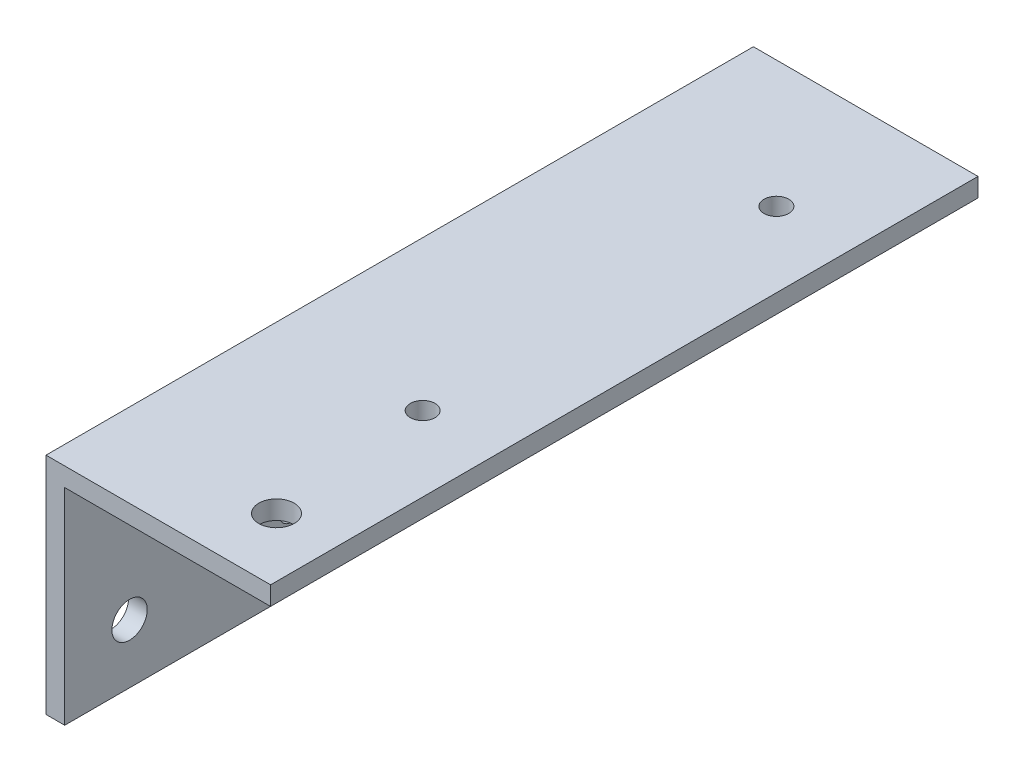
ISO-10303-21;
HEADER;
FILE_DESCRIPTION(('STEP AP214'),'2;1');
FILE_NAME('part.step','',(''),(''),'','','');
FILE_SCHEMA(('AUTOMOTIVE_DESIGN { 1 0 10303 214 1 1 1 1 }'));
ENDSEC;
DATA;
#1=APPLICATION_CONTEXT('core data for automotive mechanical design processes');
#2=APPLICATION_PROTOCOL_DEFINITION('international standard','automotive_design',2000,#1);
#3=PRODUCT_CONTEXT('',#1,'mechanical');
#4=PRODUCT('Part','Part','',(#3));
#5=PRODUCT_RELATED_PRODUCT_CATEGORY('part','',(#4));
#6=PRODUCT_DEFINITION_FORMATION('','',#4);
#7=PRODUCT_DEFINITION_CONTEXT('part definition',#1,'design');
#8=PRODUCT_DEFINITION('design','',#6,#7);
#9=PRODUCT_DEFINITION_SHAPE('','',#8);
#10=(LENGTH_UNIT() NAMED_UNIT(*) SI_UNIT(.MILLI.,.METRE.));
#11=(NAMED_UNIT(*) PLANE_ANGLE_UNIT() SI_UNIT($,.RADIAN.));
#12=(NAMED_UNIT(*) SI_UNIT($,.STERADIAN.) SOLID_ANGLE_UNIT());
#13=UNCERTAINTY_MEASURE_WITH_UNIT(LENGTH_MEASURE(1.E-05),#10,'distance_accuracy_value','');
#14=(GEOMETRIC_REPRESENTATION_CONTEXT(3) GLOBAL_UNCERTAINTY_ASSIGNED_CONTEXT((#13)) GLOBAL_UNIT_ASSIGNED_CONTEXT((#10,
#11,#12)) REPRESENTATION_CONTEXT('',''));
#15=CARTESIAN_POINT('',(0.,0.,0.));
#16=DIRECTION('',(0.,0.,1.));
#17=DIRECTION('',(1.,0.,0.));
#18=AXIS2_PLACEMENT_3D('',#15,#16,#17);
#19=CARTESIAN_POINT('',(34.925,3.17499999999999,5.));
#20=DIRECTION('',(0.,0.,1.));
#21=DIRECTION('',(1.,0.,0.));
#22=AXIS2_PLACEMENT_3D('',#19,#20,#21);
#23=PLANE('',#22);
#24=DIRECTION('',(0.,1.,0.));
#25=VECTOR('',#24,1.);
#26=CARTESIAN_POINT('',(0.,-34.925,5.));
#27=LINE('',#26,#25);
#28=CARTESIAN_POINT('',(0.,-34.925,5.));
#29=VERTEX_POINT('',#28);
#30=CARTESIAN_POINT('',(0.,0.,5.));
#31=VERTEX_POINT('',#30);
#32=EDGE_CURVE('E64',#29,#31,#27,.T.);
#33=ORIENTED_EDGE('',*,*,#32,.T.);
#34=DIRECTION('',(1.,0.,0.));
#35=VECTOR('',#34,1.);
#36=CARTESIAN_POINT('',(0.,0.,5.));
#37=LINE('',#36,#35);
#38=CARTESIAN_POINT('',(34.925,0.,5.));
#39=VERTEX_POINT('',#38);
#40=EDGE_CURVE('E119',#31,#39,#37,.T.);
#41=ORIENTED_EDGE('',*,*,#40,.T.);
#42=DIRECTION('',(0.,-1.,0.));
#43=VECTOR('',#42,1.);
#44=CARTESIAN_POINT('',(34.925,3.17499999999999,5.));
#45=LINE('',#44,#43);
#46=CARTESIAN_POINT('',(34.925,3.17499999999999,5.));
#47=VERTEX_POINT('',#46);
#48=EDGE_CURVE('E54',#47,#39,#45,.T.);
#49=ORIENTED_EDGE('',*,*,#48,.F.);
#50=DIRECTION('',(-1.,0.,0.));
#51=VECTOR('',#50,1.);
#52=CARTESIAN_POINT('',(34.925,3.17499999999999,5.));
#53=LINE('',#52,#51);
#54=CARTESIAN_POINT('',(-3.175,3.17499999999999,5.));
#55=VERTEX_POINT('',#54);
#56=EDGE_CURVE('E153',#47,#55,#53,.T.);
#57=ORIENTED_EDGE('',*,*,#56,.T.);
#58=DIRECTION('',(0.,-1.,0.));
#59=VECTOR('',#58,1.);
#60=CARTESIAN_POINT('',(-3.175,3.17499999999999,5.));
#61=LINE('',#60,#59);
#62=CARTESIAN_POINT('',(-3.175,-34.925,5.));
#63=VERTEX_POINT('',#62);
#64=EDGE_CURVE('E11',#55,#63,#61,.T.);
#65=ORIENTED_EDGE('',*,*,#64,.T.);
#66=DIRECTION('',(-1.,0.,0.));
#67=VECTOR('',#66,1.);
#68=CARTESIAN_POINT('',(34.925,-34.925,5.));
#69=LINE('',#68,#67);
#70=EDGE_CURVE('E86',#29,#63,#69,.T.);
#71=ORIENTED_EDGE('',*,*,#70,.F.);
#72=EDGE_LOOP('',(#33,#41,#49,#57,#65,#71));
#73=FACE_BOUND('',#72,.T.);
#74=ADVANCED_FACE('F44',(#73),#23,.T.);
#75=CARTESIAN_POINT('',(34.925,3.17499999999999,-115.));
#76=DIRECTION('',(1.,0.,0.));
#77=DIRECTION('',(0.,0.,-1.));
#78=AXIS2_PLACEMENT_3D('',#75,#76,#77);
#79=PLANE('',#78);
#80=ORIENTED_EDGE('',*,*,#48,.T.);
#81=DIRECTION('',(0.,0.,-1.));
#82=VECTOR('',#81,1.);
#83=CARTESIAN_POINT('',(34.925,0.,5.));
#84=LINE('',#83,#82);
#85=CARTESIAN_POINT('',(34.925,0.,-115.));
#86=VERTEX_POINT('',#85);
#87=EDGE_CURVE('E116',#39,#86,#84,.T.);
#88=ORIENTED_EDGE('',*,*,#87,.T.);
#89=DIRECTION('',(0.,-1.,0.));
#90=VECTOR('',#89,1.);
#91=CARTESIAN_POINT('',(34.925,3.17499999999999,-115.));
#92=LINE('',#91,#90);
#93=CARTESIAN_POINT('',(34.925,3.17499999999999,-115.));
#94=VERTEX_POINT('',#93);
#95=EDGE_CURVE('E166',#94,#86,#92,.T.);
#96=ORIENTED_EDGE('',*,*,#95,.F.);
#97=DIRECTION('',(0.,0.,1.));
#98=VECTOR('',#97,1.);
#99=CARTESIAN_POINT('',(34.925,3.17499999999999,-115.));
#100=LINE('',#99,#98);
#101=EDGE_CURVE('E148',#94,#47,#100,.T.);
#102=ORIENTED_EDGE('',*,*,#101,.T.);
#103=EDGE_LOOP('',(#80,#88,#96,#102));
#104=FACE_BOUND('',#103,.T.);
#105=ADVANCED_FACE('F235',(#104),#79,.T.);
#106=CARTESIAN_POINT('',(-3.175,3.17499999999999,5.));
#107=DIRECTION('',(-1.,0.,0.));
#108=DIRECTION('',(0.,0.,1.));
#109=AXIS2_PLACEMENT_3D('',#106,#107,#108);
#110=PLANE('',#109);
#111=CARTESIAN_POINT('',(-3.175,-22.225,-93.5));
#112=DIRECTION('',(-1.,0.,0.));
#113=DIRECTION('',(0.,0.,1.));
#114=AXIS2_PLACEMENT_3D('',#111,#112,#113);
#115=CIRCLE('',#114,2.09999999999999);
#116=CARTESIAN_POINT('',(-3.175,-22.225,-91.4));
#117=VERTEX_POINT('',#116);
#118=EDGE_CURVE('E210',#117,#117,#115,.T.);
#119=ORIENTED_EDGE('',*,*,#118,.F.);
#120=EDGE_LOOP('',(#119));
#121=FACE_BOUND('',#120,.T.);
#122=CARTESIAN_POINT('',(-3.175,-22.225,-33.5));
#123=DIRECTION('',(-1.,0.,0.));
#124=DIRECTION('',(0.,0.,1.));
#125=AXIS2_PLACEMENT_3D('',#122,#123,#124);
#126=CIRCLE('',#125,2.09999999999999);
#127=CARTESIAN_POINT('',(-3.175,-22.225,-31.4));
#128=VERTEX_POINT('',#127);
#129=EDGE_CURVE('E191',#128,#128,#126,.T.);
#130=ORIENTED_EDGE('',*,*,#129,.F.);
#131=EDGE_LOOP('',(#130));
#132=FACE_BOUND('',#131,.T.);
#133=CARTESIAN_POINT('',(-3.175,-24.925,-6.));
#134=DIRECTION('',(-1.,0.,0.));
#135=DIRECTION('',(0.,0.,1.));
#136=AXIS2_PLACEMENT_3D('',#133,#134,#135);
#137=CIRCLE('',#136,2.99999999999999);
#138=CARTESIAN_POINT('',(-3.175,-24.925,-3.00000000000001));
#139=VERTEX_POINT('',#138);
#140=EDGE_CURVE('E188',#139,#139,#137,.T.);
#141=ORIENTED_EDGE('',*,*,#140,.F.);
#142=EDGE_LOOP('',(#141));
#143=FACE_BOUND('',#142,.T.);
#144=DIRECTION('',(0.,0.,-1.));
#145=VECTOR('',#144,1.);
#146=CARTESIAN_POINT('',(-3.175,-34.925,5.));
#147=LINE('',#146,#145);
#148=CARTESIAN_POINT('',(-3.175,-34.925,-115.));
#149=VERTEX_POINT('',#148);
#150=EDGE_CURVE('E137',#63,#149,#147,.T.);
#151=ORIENTED_EDGE('',*,*,#150,.F.);
#152=ORIENTED_EDGE('',*,*,#64,.F.);
#153=DIRECTION('',(0.,0.,-1.));
#154=VECTOR('',#153,1.);
#155=CARTESIAN_POINT('',(-3.175,3.17499999999999,5.));
#156=LINE('',#155,#154);
#157=CARTESIAN_POINT('',(-3.175,3.17499999999999,-115.));
#158=VERTEX_POINT('',#157);
#159=EDGE_CURVE('E144',#55,#158,#156,.T.);
#160=ORIENTED_EDGE('',*,*,#159,.T.);
#161=DIRECTION('',(0.,-1.,0.));
#162=VECTOR('',#161,1.);
#163=CARTESIAN_POINT('',(-3.175,3.17499999999999,-115.));
#164=LINE('',#163,#162);
#165=EDGE_CURVE('E95',#158,#149,#164,.T.);
#166=ORIENTED_EDGE('',*,*,#165,.T.);
#167=EDGE_LOOP('',(#151,#152,#160,#166));
#168=FACE_BOUND('',#167,.T.);
#169=ADVANCED_FACE('F50',(#121,#132,#143,#168),#110,.T.);
#170=CARTESIAN_POINT('',(-3.175,3.17499999999999,-115.));
#171=DIRECTION('',(0.,0.,-1.));
#172=DIRECTION('',(-1.,0.,0.));
#173=AXIS2_PLACEMENT_3D('',#170,#171,#172);
#174=PLANE('',#173);
#175=DIRECTION('',(0.,1.,0.));
#176=VECTOR('',#175,1.);
#177=CARTESIAN_POINT('',(0.,-34.925,-115.));
#178=LINE('',#177,#176);
#179=CARTESIAN_POINT('',(0.,-34.925,-115.));
#180=VERTEX_POINT('',#179);
#181=CARTESIAN_POINT('',(0.,0.,-115.));
#182=VERTEX_POINT('',#181);
#183=EDGE_CURVE('E115',#180,#182,#178,.T.);
#184=ORIENTED_EDGE('',*,*,#183,.F.);
#185=DIRECTION('',(1.,0.,0.));
#186=VECTOR('',#185,1.);
#187=CARTESIAN_POINT('',(-3.175,-34.925,-115.));
#188=LINE('',#187,#186);
#189=EDGE_CURVE('E157',#149,#180,#188,.T.);
#190=ORIENTED_EDGE('',*,*,#189,.F.);
#191=ORIENTED_EDGE('',*,*,#165,.F.);
#192=DIRECTION('',(1.,0.,0.));
#193=VECTOR('',#192,1.);
#194=CARTESIAN_POINT('',(-3.175,3.17499999999999,-115.));
#195=LINE('',#194,#193);
#196=EDGE_CURVE('E150',#158,#94,#195,.T.);
#197=ORIENTED_EDGE('',*,*,#196,.T.);
#198=ORIENTED_EDGE('',*,*,#95,.T.);
#199=DIRECTION('',(1.,0.,0.));
#200=VECTOR('',#199,1.);
#201=CARTESIAN_POINT('',(0.,0.,-115.));
#202=LINE('',#201,#200);
#203=EDGE_CURVE('E129',#182,#86,#202,.T.);
#204=ORIENTED_EDGE('',*,*,#203,.F.);
#205=EDGE_LOOP('',(#184,#190,#191,#197,#198,#204));
#206=FACE_BOUND('',#205,.T.);
#207=ADVANCED_FACE('F221',(#206),#174,.T.);
#208=CARTESIAN_POINT('',(0.,3.17499999999999,0.));
#209=DIRECTION('',(0.,-1.,0.));
#210=DIRECTION('',(0.,0.,-1.));
#211=AXIS2_PLACEMENT_3D('',#208,#209,#210);
#212=PLANE('',#211);
#213=CARTESIAN_POINT('',(24.925,3.17499999999999,-6.));
#214=DIRECTION('',(0.,1.,0.));
#215=DIRECTION('',(0.,0.,1.));
#216=AXIS2_PLACEMENT_3D('',#213,#214,#215);
#217=CIRCLE('',#216,2.99999999999999);
#218=CARTESIAN_POINT('',(24.925,3.17499999999999,-3.00000000000001));
#219=VERTEX_POINT('',#218);
#220=EDGE_CURVE('E187',#219,#219,#217,.T.);
#221=ORIENTED_EDGE('',*,*,#220,.F.);
#222=EDGE_LOOP('',(#221));
#223=FACE_BOUND('',#222,.T.);
#224=CARTESIAN_POINT('',(22.225,3.17499999999999,-33.5));
#225=DIRECTION('',(0.,1.,0.));
#226=DIRECTION('',(0.,0.,1.));
#227=AXIS2_PLACEMENT_3D('',#224,#225,#226);
#228=CIRCLE('',#227,2.09999999999999);
#229=CARTESIAN_POINT('',(22.225,3.17499999999999,-31.4));
#230=VERTEX_POINT('',#229);
#231=EDGE_CURVE('E181',#230,#230,#228,.T.);
#232=ORIENTED_EDGE('',*,*,#231,.F.);
#233=EDGE_LOOP('',(#232));
#234=FACE_BOUND('',#233,.T.);
#235=CARTESIAN_POINT('',(22.225,3.17499999999999,-93.5));
#236=DIRECTION('',(0.,1.,0.));
#237=DIRECTION('',(0.,0.,1.));
#238=AXIS2_PLACEMENT_3D('',#235,#236,#237);
#239=CIRCLE('',#238,2.09999999999999);
#240=CARTESIAN_POINT('',(22.225,3.17499999999999,-91.4));
#241=VERTEX_POINT('',#240);
#242=EDGE_CURVE('E134',#241,#241,#239,.T.);
#243=ORIENTED_EDGE('',*,*,#242,.F.);
#244=EDGE_LOOP('',(#243));
#245=FACE_BOUND('',#244,.T.);
#246=ORIENTED_EDGE('',*,*,#159,.F.);
#247=ORIENTED_EDGE('',*,*,#56,.F.);
#248=ORIENTED_EDGE('',*,*,#101,.F.);
#249=ORIENTED_EDGE('',*,*,#196,.F.);
#250=EDGE_LOOP('',(#246,#247,#248,#249));
#251=FACE_BOUND('',#250,.T.);
#252=ADVANCED_FACE('F218',(#223,#234,#245,#251),#212,.F.);
#253=CARTESIAN_POINT('',(0.,-34.925,0.));
#254=DIRECTION('',(0.,-1.,0.));
#255=DIRECTION('',(0.,0.,-1.));
#256=AXIS2_PLACEMENT_3D('',#253,#254,#255);
#257=PLANE('',#256);
#258=DIRECTION('',(0.,0.,-1.));
#259=VECTOR('',#258,1.);
#260=CARTESIAN_POINT('',(0.,-34.925,5.));
#261=LINE('',#260,#259);
#262=EDGE_CURVE('E120',#29,#180,#261,.T.);
#263=ORIENTED_EDGE('',*,*,#262,.F.);
#264=ORIENTED_EDGE('',*,*,#70,.T.);
#265=ORIENTED_EDGE('',*,*,#150,.T.);
#266=ORIENTED_EDGE('',*,*,#189,.T.);
#267=EDGE_LOOP('',(#263,#264,#265,#266));
#268=FACE_BOUND('',#267,.T.);
#269=ADVANCED_FACE('F225',(#268),#257,.T.);
#270=CARTESIAN_POINT('',(0.,0.,5.));
#271=DIRECTION('',(0.,1.,0.));
#272=DIRECTION('',(0.,0.,1.));
#273=AXIS2_PLACEMENT_3D('',#270,#271,#272);
#274=PLANE('',#273);
#275=CARTESIAN_POINT('',(24.925,0.,-6.));
#276=DIRECTION('',(0.,1.,0.));
#277=DIRECTION('',(0.,0.,1.));
#278=AXIS2_PLACEMENT_3D('',#275,#276,#277);
#279=CIRCLE('',#278,2.99999999999998);
#280=CARTESIAN_POINT('',(24.925,0.,-3.00000000000002));
#281=VERTEX_POINT('',#280);
#282=EDGE_CURVE('E185',#281,#281,#279,.T.);
#283=ORIENTED_EDGE('',*,*,#282,.T.);
#284=EDGE_LOOP('',(#283));
#285=FACE_BOUND('',#284,.T.);
#286=CARTESIAN_POINT('',(22.225,0.,-33.5));
#287=DIRECTION('',(0.,1.,0.));
#288=DIRECTION('',(0.,0.,1.));
#289=AXIS2_PLACEMENT_3D('',#286,#287,#288);
#290=CIRCLE('',#289,2.09999999999999);
#291=CARTESIAN_POINT('',(22.225,0.,-31.4));
#292=VERTEX_POINT('',#291);
#293=EDGE_CURVE('E180',#292,#292,#290,.T.);
#294=ORIENTED_EDGE('',*,*,#293,.T.);
#295=EDGE_LOOP('',(#294));
#296=FACE_BOUND('',#295,.T.);
#297=CARTESIAN_POINT('',(22.225,0.,-93.5));
#298=DIRECTION('',(0.,1.,0.));
#299=DIRECTION('',(0.,0.,1.));
#300=AXIS2_PLACEMENT_3D('',#297,#298,#299);
#301=CIRCLE('',#300,2.09999999999999);
#302=CARTESIAN_POINT('',(22.225,0.,-91.4));
#303=VERTEX_POINT('',#302);
#304=EDGE_CURVE('E140',#303,#303,#301,.T.);
#305=ORIENTED_EDGE('',*,*,#304,.T.);
#306=EDGE_LOOP('',(#305));
#307=FACE_BOUND('',#306,.T.);
#308=ORIENTED_EDGE('',*,*,#203,.T.);
#309=ORIENTED_EDGE('',*,*,#87,.F.);
#310=ORIENTED_EDGE('',*,*,#40,.F.);
#311=DIRECTION('',(0.,0.,-1.));
#312=VECTOR('',#311,1.);
#313=CARTESIAN_POINT('',(0.,0.,5.));
#314=LINE('',#313,#312);
#315=EDGE_CURVE('E108',#31,#182,#314,.T.);
#316=ORIENTED_EDGE('',*,*,#315,.T.);
#317=EDGE_LOOP('',(#308,#309,#310,#316));
#318=FACE_BOUND('',#317,.T.);
#319=ADVANCED_FACE('F122',(#285,#296,#307,#318),#274,.F.);
#320=CARTESIAN_POINT('',(0.,-34.925,5.));
#321=DIRECTION('',(-1.,0.,0.));
#322=DIRECTION('',(0.,0.,1.));
#323=AXIS2_PLACEMENT_3D('',#320,#321,#322);
#324=PLANE('',#323);
#325=CARTESIAN_POINT('',(0.,-22.225,-93.5));
#326=DIRECTION('',(-1.,0.,0.));
#327=DIRECTION('',(0.,0.,1.));
#328=AXIS2_PLACEMENT_3D('',#325,#326,#327);
#329=CIRCLE('',#328,2.09999999999999);
#330=CARTESIAN_POINT('',(0.,-22.225,-91.4));
#331=VERTEX_POINT('',#330);
#332=EDGE_CURVE('E47',#331,#331,#329,.T.);
#333=ORIENTED_EDGE('',*,*,#332,.T.);
#334=EDGE_LOOP('',(#333));
#335=FACE_BOUND('',#334,.T.);
#336=CARTESIAN_POINT('',(0.,-22.225,-33.5));
#337=DIRECTION('',(-1.,0.,0.));
#338=DIRECTION('',(0.,0.,1.));
#339=AXIS2_PLACEMENT_3D('',#336,#337,#338);
#340=CIRCLE('',#339,2.09999999999999);
#341=CARTESIAN_POINT('',(0.,-22.225,-31.4));
#342=VERTEX_POINT('',#341);
#343=EDGE_CURVE('E192',#342,#342,#340,.T.);
#344=ORIENTED_EDGE('',*,*,#343,.T.);
#345=EDGE_LOOP('',(#344));
#346=FACE_BOUND('',#345,.T.);
#347=CARTESIAN_POINT('',(0.,-24.925,-6.));
#348=DIRECTION('',(-1.,0.,0.));
#349=DIRECTION('',(0.,0.,1.));
#350=AXIS2_PLACEMENT_3D('',#347,#348,#349);
#351=CIRCLE('',#350,2.99999999999999);
#352=CARTESIAN_POINT('',(0.,-24.925,-3.00000000000001));
#353=VERTEX_POINT('',#352);
#354=EDGE_CURVE('E190',#353,#353,#351,.T.);
#355=ORIENTED_EDGE('',*,*,#354,.T.);
#356=EDGE_LOOP('',(#355));
#357=FACE_BOUND('',#356,.T.);
#358=ORIENTED_EDGE('',*,*,#183,.T.);
#359=ORIENTED_EDGE('',*,*,#315,.F.);
#360=ORIENTED_EDGE('',*,*,#32,.F.);
#361=ORIENTED_EDGE('',*,*,#262,.T.);
#362=EDGE_LOOP('',(#358,#359,#360,#361));
#363=FACE_BOUND('',#362,.T.);
#364=ADVANCED_FACE('F109',(#335,#346,#357,#363),#324,.F.);
#365=CARTESIAN_POINT('',(22.225,3.17499999999999,-93.5));
#366=DIRECTION('',(0.,1.,0.));
#367=DIRECTION('',(0.,0.,1.));
#368=AXIS2_PLACEMENT_3D('',#365,#366,#367);
#369=CYLINDRICAL_SURFACE('',#368,2.09999999999999);
#370=ORIENTED_EDGE('',*,*,#242,.T.);
#371=EDGE_LOOP('',(#370));
#372=FACE_BOUND('',#371,.T.);
#373=ORIENTED_EDGE('',*,*,#304,.F.);
#374=EDGE_LOOP('',(#373));
#375=FACE_BOUND('',#374,.T.);
#376=ADVANCED_FACE('F255',(#372,#375),#369,.F.);
#377=CARTESIAN_POINT('',(22.225,3.17499999999999,-33.5));
#378=DIRECTION('',(0.,1.,0.));
#379=DIRECTION('',(0.,0.,1.));
#380=AXIS2_PLACEMENT_3D('',#377,#378,#379);
#381=CYLINDRICAL_SURFACE('',#380,2.09999999999999);
#382=ORIENTED_EDGE('',*,*,#231,.T.);
#383=EDGE_LOOP('',(#382));
#384=FACE_BOUND('',#383,.T.);
#385=ORIENTED_EDGE('',*,*,#293,.F.);
#386=EDGE_LOOP('',(#385));
#387=FACE_BOUND('',#386,.T.);
#388=ADVANCED_FACE('F216',(#384,#387),#381,.F.);
#389=CARTESIAN_POINT('',(24.925,3.17499999999999,-6.));
#390=DIRECTION('',(0.,1.,0.));
#391=DIRECTION('',(0.,0.,1.));
#392=AXIS2_PLACEMENT_3D('',#389,#390,#391);
#393=CYLINDRICAL_SURFACE('',#392,2.99999999999998);
#394=ORIENTED_EDGE('',*,*,#220,.T.);
#395=EDGE_LOOP('',(#394));
#396=FACE_BOUND('',#395,.T.);
#397=ORIENTED_EDGE('',*,*,#282,.F.);
#398=EDGE_LOOP('',(#397));
#399=FACE_BOUND('',#398,.T.);
#400=ADVANCED_FACE('F261',(#396,#399),#393,.F.);
#401=CARTESIAN_POINT('',(-3.175,-24.925,-6.));
#402=DIRECTION('',(-1.,0.,0.));
#403=DIRECTION('',(0.,0.,1.));
#404=AXIS2_PLACEMENT_3D('',#401,#402,#403);
#405=CYLINDRICAL_SURFACE('',#404,2.99999999999999);
#406=ORIENTED_EDGE('',*,*,#140,.T.);
#407=EDGE_LOOP('',(#406));
#408=FACE_BOUND('',#407,.T.);
#409=ORIENTED_EDGE('',*,*,#354,.F.);
#410=EDGE_LOOP('',(#409));
#411=FACE_BOUND('',#410,.T.);
#412=ADVANCED_FACE('F263',(#408,#411),#405,.F.);
#413=CARTESIAN_POINT('',(-3.175,-22.225,-33.5));
#414=DIRECTION('',(-1.,0.,0.));
#415=DIRECTION('',(0.,0.,1.));
#416=AXIS2_PLACEMENT_3D('',#413,#414,#415);
#417=CYLINDRICAL_SURFACE('',#416,2.09999999999999);
#418=ORIENTED_EDGE('',*,*,#129,.T.);
#419=EDGE_LOOP('',(#418));
#420=FACE_BOUND('',#419,.T.);
#421=ORIENTED_EDGE('',*,*,#343,.F.);
#422=EDGE_LOOP('',(#421));
#423=FACE_BOUND('',#422,.T.);
#424=ADVANCED_FACE('F266',(#420,#423),#417,.F.);
#425=CARTESIAN_POINT('',(-3.175,-22.225,-93.5));
#426=DIRECTION('',(-1.,0.,0.));
#427=DIRECTION('',(0.,0.,1.));
#428=AXIS2_PLACEMENT_3D('',#425,#426,#427);
#429=CYLINDRICAL_SURFACE('',#428,2.09999999999999);
#430=ORIENTED_EDGE('',*,*,#118,.T.);
#431=EDGE_LOOP('',(#430));
#432=FACE_BOUND('',#431,.T.);
#433=ORIENTED_EDGE('',*,*,#332,.F.);
#434=EDGE_LOOP('',(#433));
#435=FACE_BOUND('',#434,.T.);
#436=ADVANCED_FACE('F275',(#432,#435),#429,.F.);
#437=CLOSED_SHELL('',(#74,#105,#169,#207,#252,#269,#319,#364,#376,#388,#400,#412,#424,#436));
#438=MANIFOLD_SOLID_BREP('B2',#437);
#439=ADVANCED_BREP_SHAPE_REPRESENTATION('',(#18,#438),#14);
#440=SHAPE_DEFINITION_REPRESENTATION(#9,#439);
ENDSEC;
END-ISO-10303-21;
